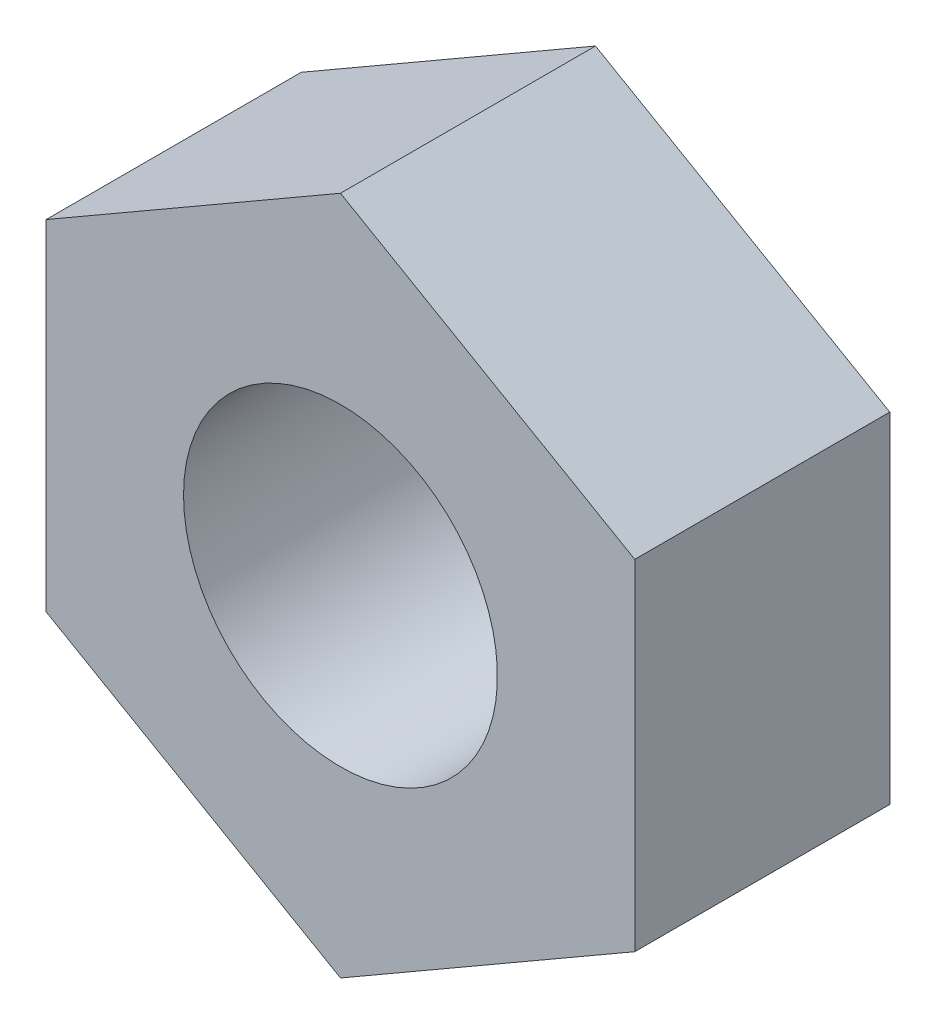
ISO-10303-21;
HEADER;
FILE_DESCRIPTION(('STEP AP214'),'2;1');
FILE_NAME('part.step','',(''),(''),'','','');
FILE_SCHEMA(('AUTOMOTIVE_DESIGN { 1 0 10303 214 1 1 1 1 }'));
ENDSEC;
DATA;
#1=APPLICATION_CONTEXT('core data for automotive mechanical design processes');
#2=APPLICATION_PROTOCOL_DEFINITION('international standard','automotive_design',2000,#1);
#3=PRODUCT_CONTEXT('',#1,'mechanical');
#4=PRODUCT('Part','Part','',(#3));
#5=PRODUCT_RELATED_PRODUCT_CATEGORY('part','',(#4));
#6=PRODUCT_DEFINITION_FORMATION('','',#4);
#7=PRODUCT_DEFINITION_CONTEXT('part definition',#1,'design');
#8=PRODUCT_DEFINITION('design','',#6,#7);
#9=PRODUCT_DEFINITION_SHAPE('','',#8);
#10=(LENGTH_UNIT() NAMED_UNIT(*) SI_UNIT(.MILLI.,.METRE.));
#11=(NAMED_UNIT(*) PLANE_ANGLE_UNIT() SI_UNIT($,.RADIAN.));
#12=(NAMED_UNIT(*) SI_UNIT($,.STERADIAN.) SOLID_ANGLE_UNIT());
#13=UNCERTAINTY_MEASURE_WITH_UNIT(LENGTH_MEASURE(1.E-05),#10,'distance_accuracy_value','');
#14=(GEOMETRIC_REPRESENTATION_CONTEXT(3) GLOBAL_UNCERTAINTY_ASSIGNED_CONTEXT((#13)) GLOBAL_UNIT_ASSIGNED_CONTEXT((#10,
#11,#12)) REPRESENTATION_CONTEXT('',''));
#15=CARTESIAN_POINT('',(0.,0.,0.));
#16=DIRECTION('',(0.,0.,1.));
#17=DIRECTION('',(1.,0.,0.));
#18=AXIS2_PLACEMENT_3D('',#15,#16,#17);
#19=CARTESIAN_POINT('',(0.,0.,13.));
#20=DIRECTION('',(0.,0.,1.));
#21=DIRECTION('',(1.,0.,0.));
#22=AXIS2_PLACEMENT_3D('',#19,#20,#21);
#23=PLANE('',#22);
#24=DIRECTION('',(0.866025403784439,0.5,0.));
#25=VECTOR('',#24,1.);
#26=CARTESIAN_POINT('',(0.,-17.3205080756888,13.));
#27=LINE('',#26,#25);
#28=CARTESIAN_POINT('',(0.,-17.3205080756888,13.));
#29=VERTEX_POINT('',#28);
#30=CARTESIAN_POINT('',(15.,-8.66025403784439,13.));
#31=VERTEX_POINT('',#30);
#32=EDGE_CURVE('E140',#29,#31,#27,.T.);
#33=ORIENTED_EDGE('',*,*,#32,.T.);
#34=DIRECTION('',(0.,1.,0.));
#35=VECTOR('',#34,1.);
#36=CARTESIAN_POINT('',(15.,-8.66025403784439,13.));
#37=LINE('',#36,#35);
#38=CARTESIAN_POINT('',(15.,8.66025403784439,13.));
#39=VERTEX_POINT('',#38);
#40=EDGE_CURVE('E94',#31,#39,#37,.T.);
#41=ORIENTED_EDGE('',*,*,#40,.T.);
#42=DIRECTION('',(-0.866025403784439,0.5,0.));
#43=VECTOR('',#42,1.);
#44=CARTESIAN_POINT('',(15.,8.66025403784439,13.));
#45=LINE('',#44,#43);
#46=CARTESIAN_POINT('',(0.,17.3205080756888,13.));
#47=VERTEX_POINT('',#46);
#48=EDGE_CURVE('E106',#39,#47,#45,.T.);
#49=ORIENTED_EDGE('',*,*,#48,.T.);
#50=DIRECTION('',(-0.866025403784439,-0.5,0.));
#51=VECTOR('',#50,1.);
#52=CARTESIAN_POINT('',(0.,17.3205080756888,13.));
#53=LINE('',#52,#51);
#54=CARTESIAN_POINT('',(-15.,8.66025403784439,13.));
#55=VERTEX_POINT('',#54);
#56=EDGE_CURVE('E105',#47,#55,#53,.T.);
#57=ORIENTED_EDGE('',*,*,#56,.T.);
#58=DIRECTION('',(0.,-1.,0.));
#59=VECTOR('',#58,1.);
#60=CARTESIAN_POINT('',(-15.,8.66025403784439,13.));
#61=LINE('',#60,#59);
#62=CARTESIAN_POINT('',(-15.,-8.66025403784439,13.));
#63=VERTEX_POINT('',#62);
#64=EDGE_CURVE('E108',#55,#63,#61,.T.);
#65=ORIENTED_EDGE('',*,*,#64,.T.);
#66=DIRECTION('',(0.866025403784439,-0.5,0.));
#67=VECTOR('',#66,1.);
#68=CARTESIAN_POINT('',(-15.,-8.66025403784439,13.));
#69=LINE('',#68,#67);
#70=EDGE_CURVE('E59',#63,#29,#69,.T.);
#71=ORIENTED_EDGE('',*,*,#70,.T.);
#72=EDGE_LOOP('',(#33,#41,#49,#57,#65,#71));
#73=FACE_BOUND('',#72,.T.);
#74=CARTESIAN_POINT('',(0.,0.,13.));
#75=DIRECTION('',(0.,0.,1.));
#76=DIRECTION('',(1.,0.,0.));
#77=AXIS2_PLACEMENT_3D('',#74,#75,#76);
#78=CIRCLE('',#77,8.);
#79=CARTESIAN_POINT('',(-8.,0.,13.));
#80=VERTEX_POINT('',#79);
#81=EDGE_CURVE('E127',#80,#80,#78,.T.);
#82=ORIENTED_EDGE('',*,*,#81,.F.);
#83=EDGE_LOOP('',(#82));
#84=FACE_BOUND('',#83,.T.);
#85=ADVANCED_FACE('F41',(#73,#84),#23,.T.);
#86=CARTESIAN_POINT('',(0.,0.,0.));
#87=DIRECTION('',(0.,0.,1.));
#88=DIRECTION('',(1.,0.,0.));
#89=AXIS2_PLACEMENT_3D('',#86,#87,#88);
#90=PLANE('',#89);
#91=DIRECTION('',(0.866025403784439,0.5,0.));
#92=VECTOR('',#91,1.);
#93=CARTESIAN_POINT('',(0.,-17.3205080756888,0.));
#94=LINE('',#93,#92);
#95=CARTESIAN_POINT('',(0.,-17.3205080756888,0.));
#96=VERTEX_POINT('',#95);
#97=CARTESIAN_POINT('',(15.,-8.66025403784439,0.));
#98=VERTEX_POINT('',#97);
#99=EDGE_CURVE('E128',#96,#98,#94,.T.);
#100=ORIENTED_EDGE('',*,*,#99,.F.);
#101=DIRECTION('',(0.866025403784439,-0.5,0.));
#102=VECTOR('',#101,1.);
#103=CARTESIAN_POINT('',(-15.,-8.66025403784439,0.));
#104=LINE('',#103,#102);
#105=CARTESIAN_POINT('',(-15.,-8.66025403784439,0.));
#106=VERTEX_POINT('',#105);
#107=EDGE_CURVE('E90',#106,#96,#104,.T.);
#108=ORIENTED_EDGE('',*,*,#107,.F.);
#109=DIRECTION('',(0.,-1.,0.));
#110=VECTOR('',#109,1.);
#111=CARTESIAN_POINT('',(-15.,8.66025403784439,0.));
#112=LINE('',#111,#110);
#113=CARTESIAN_POINT('',(-15.,8.66025403784439,0.));
#114=VERTEX_POINT('',#113);
#115=EDGE_CURVE('E83',#114,#106,#112,.T.);
#116=ORIENTED_EDGE('',*,*,#115,.F.);
#117=DIRECTION('',(-0.866025403784439,-0.5,0.));
#118=VECTOR('',#117,1.);
#119=CARTESIAN_POINT('',(0.,17.3205080756888,0.));
#120=LINE('',#119,#118);
#121=CARTESIAN_POINT('',(0.,17.3205080756888,0.));
#122=VERTEX_POINT('',#121);
#123=EDGE_CURVE('E118',#122,#114,#120,.T.);
#124=ORIENTED_EDGE('',*,*,#123,.F.);
#125=DIRECTION('',(-0.866025403784439,0.5,0.));
#126=VECTOR('',#125,1.);
#127=CARTESIAN_POINT('',(15.,8.66025403784439,0.));
#128=LINE('',#127,#126);
#129=CARTESIAN_POINT('',(15.,8.66025403784439,0.));
#130=VERTEX_POINT('',#129);
#131=EDGE_CURVE('E135',#130,#122,#128,.T.);
#132=ORIENTED_EDGE('',*,*,#131,.F.);
#133=DIRECTION('',(0.,1.,0.));
#134=VECTOR('',#133,1.);
#135=CARTESIAN_POINT('',(15.,-8.66025403784439,0.));
#136=LINE('',#135,#134);
#137=EDGE_CURVE('E129',#98,#130,#136,.T.);
#138=ORIENTED_EDGE('',*,*,#137,.F.);
#139=EDGE_LOOP('',(#100,#108,#116,#124,#132,#138));
#140=FACE_BOUND('',#139,.T.);
#141=CARTESIAN_POINT('',(0.,0.,0.));
#142=DIRECTION('',(0.,0.,1.));
#143=DIRECTION('',(1.,0.,0.));
#144=AXIS2_PLACEMENT_3D('',#141,#142,#143);
#145=CIRCLE('',#144,8.);
#146=CARTESIAN_POINT('',(-8.,0.,0.));
#147=VERTEX_POINT('',#146);
#148=EDGE_CURVE('E229',#147,#147,#145,.T.);
#149=ORIENTED_EDGE('',*,*,#148,.T.);
#150=EDGE_LOOP('',(#149));
#151=FACE_BOUND('',#150,.T.);
#152=ADVANCED_FACE('F147',(#140,#151),#90,.F.);
#153=CARTESIAN_POINT('',(0.,-17.3205080756888,13.));
#154=DIRECTION('',(-0.5,0.866025403784439,0.));
#155=DIRECTION('',(-0.866025403784439,-0.5,0.));
#156=AXIS2_PLACEMENT_3D('',#153,#154,#155);
#157=PLANE('',#156);
#158=ORIENTED_EDGE('',*,*,#99,.T.);
#159=DIRECTION('',(0.,0.,-1.));
#160=VECTOR('',#159,1.);
#161=CARTESIAN_POINT('',(15.,-8.66025403784439,13.));
#162=LINE('',#161,#160);
#163=EDGE_CURVE('E11',#31,#98,#162,.T.);
#164=ORIENTED_EDGE('',*,*,#163,.F.);
#165=ORIENTED_EDGE('',*,*,#32,.F.);
#166=DIRECTION('',(0.,0.,-1.));
#167=VECTOR('',#166,1.);
#168=CARTESIAN_POINT('',(0.,-17.3205080756888,13.));
#169=LINE('',#168,#167);
#170=EDGE_CURVE('E122',#29,#96,#169,.T.);
#171=ORIENTED_EDGE('',*,*,#170,.T.);
#172=EDGE_LOOP('',(#158,#164,#165,#171));
#173=FACE_BOUND('',#172,.T.);
#174=ADVANCED_FACE('F43',(#173),#157,.F.);
#175=CARTESIAN_POINT('',(15.,-8.66025403784439,13.));
#176=DIRECTION('',(-1.,0.,0.));
#177=DIRECTION('',(0.,0.,1.));
#178=AXIS2_PLACEMENT_3D('',#175,#176,#177);
#179=PLANE('',#178);
#180=ORIENTED_EDGE('',*,*,#137,.T.);
#181=DIRECTION('',(0.,0.,-1.));
#182=VECTOR('',#181,1.);
#183=CARTESIAN_POINT('',(15.,8.66025403784439,13.));
#184=LINE('',#183,#182);
#185=EDGE_CURVE('E49',#39,#130,#184,.T.);
#186=ORIENTED_EDGE('',*,*,#185,.F.);
#187=ORIENTED_EDGE('',*,*,#40,.F.);
#188=ORIENTED_EDGE('',*,*,#163,.T.);
#189=EDGE_LOOP('',(#180,#186,#187,#188));
#190=FACE_BOUND('',#189,.T.);
#191=ADVANCED_FACE('F173',(#190),#179,.F.);
#192=CARTESIAN_POINT('',(15.,8.66025403784439,13.));
#193=DIRECTION('',(-0.5,-0.866025403784439,0.));
#194=DIRECTION('',(0.866025403784439,-0.5,0.));
#195=AXIS2_PLACEMENT_3D('',#192,#193,#194);
#196=PLANE('',#195);
#197=ORIENTED_EDGE('',*,*,#131,.T.);
#198=DIRECTION('',(0.,0.,-1.));
#199=VECTOR('',#198,1.);
#200=CARTESIAN_POINT('',(0.,17.3205080756888,13.));
#201=LINE('',#200,#199);
#202=EDGE_CURVE('E120',#47,#122,#201,.T.);
#203=ORIENTED_EDGE('',*,*,#202,.F.);
#204=ORIENTED_EDGE('',*,*,#48,.F.);
#205=ORIENTED_EDGE('',*,*,#185,.T.);
#206=EDGE_LOOP('',(#197,#203,#204,#205));
#207=FACE_BOUND('',#206,.T.);
#208=ADVANCED_FACE('F142',(#207),#196,.F.);
#209=CARTESIAN_POINT('',(0.,17.3205080756888,13.));
#210=DIRECTION('',(0.5,-0.866025403784439,0.));
#211=DIRECTION('',(0.866025403784439,0.5,0.));
#212=AXIS2_PLACEMENT_3D('',#209,#210,#211);
#213=PLANE('',#212);
#214=ORIENTED_EDGE('',*,*,#123,.T.);
#215=DIRECTION('',(0.,0.,-1.));
#216=VECTOR('',#215,1.);
#217=CARTESIAN_POINT('',(-15.,8.66025403784439,13.));
#218=LINE('',#217,#216);
#219=EDGE_CURVE('E111',#55,#114,#218,.T.);
#220=ORIENTED_EDGE('',*,*,#219,.F.);
#221=ORIENTED_EDGE('',*,*,#56,.F.);
#222=ORIENTED_EDGE('',*,*,#202,.T.);
#223=EDGE_LOOP('',(#214,#220,#221,#222));
#224=FACE_BOUND('',#223,.T.);
#225=ADVANCED_FACE('F114',(#224),#213,.F.);
#226=CARTESIAN_POINT('',(-15.,8.66025403784439,13.));
#227=DIRECTION('',(1.,0.,0.));
#228=DIRECTION('',(0.,1.,0.));
#229=AXIS2_PLACEMENT_3D('',#226,#227,#228);
#230=PLANE('',#229);
#231=ORIENTED_EDGE('',*,*,#115,.T.);
#232=DIRECTION('',(0.,0.,-1.));
#233=VECTOR('',#232,1.);
#234=CARTESIAN_POINT('',(-15.,-8.66025403784439,13.));
#235=LINE('',#234,#233);
#236=EDGE_CURVE('E116',#63,#106,#235,.T.);
#237=ORIENTED_EDGE('',*,*,#236,.F.);
#238=ORIENTED_EDGE('',*,*,#64,.F.);
#239=ORIENTED_EDGE('',*,*,#219,.T.);
#240=EDGE_LOOP('',(#231,#237,#238,#239));
#241=FACE_BOUND('',#240,.T.);
#242=ADVANCED_FACE('F119',(#241),#230,.F.);
#243=CARTESIAN_POINT('',(-15.,-8.66025403784439,13.));
#244=DIRECTION('',(0.5,0.866025403784439,0.));
#245=DIRECTION('',(-0.866025403784439,0.5,0.));
#246=AXIS2_PLACEMENT_3D('',#243,#244,#245);
#247=PLANE('',#246);
#248=ORIENTED_EDGE('',*,*,#107,.T.);
#249=ORIENTED_EDGE('',*,*,#170,.F.);
#250=ORIENTED_EDGE('',*,*,#70,.F.);
#251=ORIENTED_EDGE('',*,*,#236,.T.);
#252=EDGE_LOOP('',(#248,#249,#250,#251));
#253=FACE_BOUND('',#252,.T.);
#254=ADVANCED_FACE('F153',(#253),#247,.F.);
#255=CARTESIAN_POINT('',(0.,0.,13.));
#256=DIRECTION('',(0.,0.,-1.));
#257=DIRECTION('',(-1.,0.,0.));
#258=AXIS2_PLACEMENT_3D('',#255,#256,#257);
#259=CYLINDRICAL_SURFACE('',#258,8.);
#260=CARTESIAN_POINT('',(-8.,0.,13.));
#261=CARTESIAN_POINT('',(-8.,0.,12.8645833333333));
#262=CARTESIAN_POINT('',(-8.,0.,12.7291666666667));
#263=CARTESIAN_POINT('',(-8.,0.,12.4583333333333));
#264=CARTESIAN_POINT('',(-8.,0.,12.3229166666667));
#265=CARTESIAN_POINT('',(-8.,0.,12.0520833333333));
#266=CARTESIAN_POINT('',(-8.,0.,11.9166666666667));
#267=CARTESIAN_POINT('',(-8.,0.,11.6458333333333));
#268=CARTESIAN_POINT('',(-8.,0.,11.5104166666667));
#269=CARTESIAN_POINT('',(-8.,0.,11.2395833333333));
#270=CARTESIAN_POINT('',(-8.,0.,11.1041666666667));
#271=CARTESIAN_POINT('',(-8.,0.,10.8333333333333));
#272=CARTESIAN_POINT('',(-8.,0.,10.6979166666667));
#273=CARTESIAN_POINT('',(-8.,0.,10.4270833333333));
#274=CARTESIAN_POINT('',(-8.,0.,10.2916666666667));
#275=CARTESIAN_POINT('',(-8.,0.,10.0208333333333));
#276=CARTESIAN_POINT('',(-8.,0.,9.88541666666667));
#277=CARTESIAN_POINT('',(-8.,0.,9.61458333333333));
#278=CARTESIAN_POINT('',(-8.,0.,9.47916666666667));
#279=CARTESIAN_POINT('',(-8.,0.,9.20833333333333));
#280=CARTESIAN_POINT('',(-8.,0.,9.07291666666666));
#281=CARTESIAN_POINT('',(-8.,0.,8.80208333333333));
#282=CARTESIAN_POINT('',(-8.,0.,8.66666666666667));
#283=CARTESIAN_POINT('',(-8.,0.,8.39583333333333));
#284=CARTESIAN_POINT('',(-8.,0.,8.26041666666667));
#285=CARTESIAN_POINT('',(-8.,0.,7.98958333333333));
#286=CARTESIAN_POINT('',(-8.,0.,7.85416666666667));
#287=CARTESIAN_POINT('',(-8.,0.,7.58333333333333));
#288=CARTESIAN_POINT('',(-8.,0.,7.44791666666667));
#289=CARTESIAN_POINT('',(-8.,0.,7.17708333333333));
#290=CARTESIAN_POINT('',(-8.,0.,7.04166666666667));
#291=CARTESIAN_POINT('',(-8.,0.,6.77083333333333));
#292=CARTESIAN_POINT('',(-8.,0.,6.63541666666667));
#293=CARTESIAN_POINT('',(-8.,0.,6.36458333333333));
#294=CARTESIAN_POINT('',(-8.,0.,6.22916666666667));
#295=CARTESIAN_POINT('',(-8.,0.,5.95833333333333));
#296=CARTESIAN_POINT('',(-8.,0.,5.82291666666667));
#297=CARTESIAN_POINT('',(-8.,0.,5.55208333333333));
#298=CARTESIAN_POINT('',(-8.,0.,5.41666666666667));
#299=CARTESIAN_POINT('',(-8.,0.,5.14583333333333));
#300=CARTESIAN_POINT('',(-8.,0.,5.01041666666667));
#301=CARTESIAN_POINT('',(-8.,0.,4.73958333333333));
#302=CARTESIAN_POINT('',(-8.,0.,4.60416666666667));
#303=CARTESIAN_POINT('',(-8.,0.,4.33333333333333));
#304=CARTESIAN_POINT('',(-8.,0.,4.19791666666667));
#305=CARTESIAN_POINT('',(-8.,0.,3.92708333333333));
#306=CARTESIAN_POINT('',(-8.,0.,3.79166666666667));
#307=CARTESIAN_POINT('',(-8.,0.,3.52083333333333));
#308=CARTESIAN_POINT('',(-8.,0.,3.38541666666667));
#309=CARTESIAN_POINT('',(-8.,0.,3.11458333333333));
#310=CARTESIAN_POINT('',(-8.,0.,2.97916666666667));
#311=CARTESIAN_POINT('',(-8.,0.,2.70833333333333));
#312=CARTESIAN_POINT('',(-8.,0.,2.57291666666667));
#313=CARTESIAN_POINT('',(-8.,0.,2.30208333333333));
#314=CARTESIAN_POINT('',(-8.,0.,2.16666666666667));
#315=CARTESIAN_POINT('',(-8.,0.,1.89583333333333));
#316=CARTESIAN_POINT('',(-8.,0.,1.76041666666667));
#317=CARTESIAN_POINT('',(-8.,0.,1.48958333333333));
#318=CARTESIAN_POINT('',(-8.,0.,1.35416666666667));
#319=CARTESIAN_POINT('',(-8.,0.,1.08333333333333));
#320=CARTESIAN_POINT('',(-8.,0.,0.947916666666667));
#321=CARTESIAN_POINT('',(-8.,0.,0.677083333333334));
#322=CARTESIAN_POINT('',(-8.,0.,0.541666666666667));
#323=CARTESIAN_POINT('',(-8.,0.,0.270833333333334));
#324=CARTESIAN_POINT('',(-8.,0.,0.135416666666667));
#325=CARTESIAN_POINT('',(-8.,0.,0.));
#326=B_SPLINE_CURVE_WITH_KNOTS('',3,(#260,#261,#262,#263,#264,#265,#266,#267,#268,#269,#270,
#271,#272,#273,#274,#275,#276,#277,#278,#279,#280,#281,#282,#283,#284,#285,#286,#287,#288,#289,
#290,#291,#292,#293,#294,#295,#296,#297,#298,#299,#300,#301,#302,#303,#304,#305,#306,#307,#308,
#309,#310,#311,#312,#313,#314,#315,#316,#317,#318,#319,#320,#321,#322,#323,#324,#325),
.UNSPECIFIED.,.F.,.F.,(4,2,2,2,2,2,2,2,2,2,2,2,2,2,2,2,2,2,2,2,2,2,2,2,2,2,2,2,2,2,2,2,4),(0.,
0.40625,0.812500000000001,1.21875,1.625,2.03125,2.4375,2.84375,3.25,3.65625,4.0625,4.46875,
4.875,5.28125,5.6875,6.09375,6.5,6.90625,7.3125,7.71875,8.125,8.53125,8.9375,9.34375,9.75,
10.15625,10.5625,10.96875,11.375,11.78125,12.1875,12.59375,13.),.UNSPECIFIED.);
#327=EDGE_CURVE('BSEAM151',#80,#147,#326,.T.);
#328=ORIENTED_EDGE('',*,*,#81,.T.);
#329=ORIENTED_EDGE('',*,*,#148,.F.);
#330=ORIENTED_EDGE('',*,*,#327,.T.);
#331=ORIENTED_EDGE('',*,*,#327,.F.);
#332=EDGE_LOOP('',(#328,#330,#329,#331));
#333=FACE_BOUND('',#332,.T.);
#334=ADVANCED_FACE('F151',(#333),#259,.F.);
#335=CLOSED_SHELL('',(#85,#152,#174,#191,#208,#225,#242,#254,#334));
#336=MANIFOLD_SOLID_BREP('B2',#335);
#337=ADVANCED_BREP_SHAPE_REPRESENTATION('',(#18,#336),#14);
#338=SHAPE_DEFINITION_REPRESENTATION(#9,#337);
ENDSEC;
END-ISO-10303-21;
